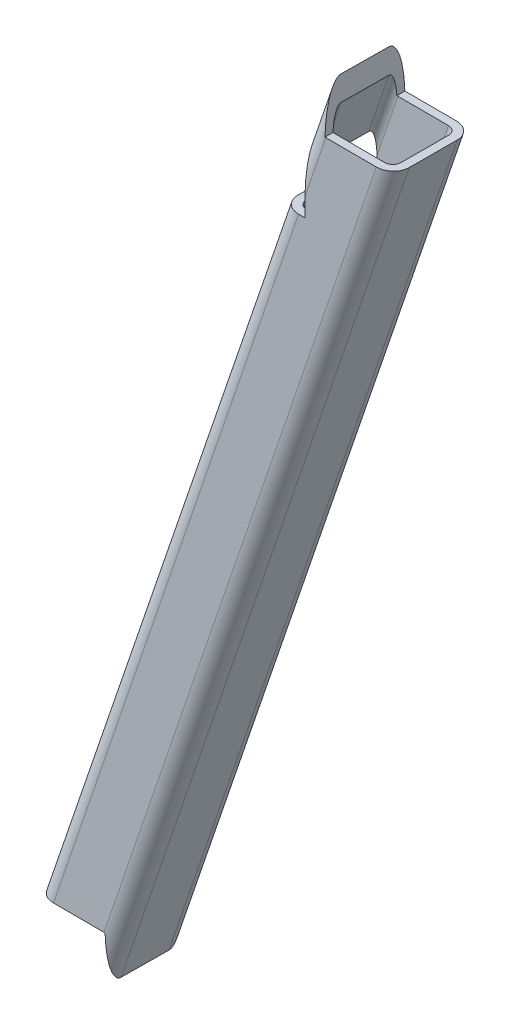
ISO-10303-21;
HEADER;
FILE_DESCRIPTION(('STEP AP214'),'2;1');
FILE_NAME('part.step','',(''),(''),'','','');
FILE_SCHEMA(('AUTOMOTIVE_DESIGN { 1 0 10303 214 1 1 1 1 }'));
ENDSEC;
DATA;
#1=APPLICATION_CONTEXT('core data for automotive mechanical design processes');
#2=APPLICATION_PROTOCOL_DEFINITION('international standard','automotive_design',2000,#1);
#3=PRODUCT_CONTEXT('',#1,'mechanical');
#4=PRODUCT('Part','Part','',(#3));
#5=PRODUCT_RELATED_PRODUCT_CATEGORY('part','',(#4));
#6=PRODUCT_DEFINITION_FORMATION('','',#4);
#7=PRODUCT_DEFINITION_CONTEXT('part definition',#1,'design');
#8=PRODUCT_DEFINITION('design','',#6,#7);
#9=PRODUCT_DEFINITION_SHAPE('','',#8);
#10=(LENGTH_UNIT() NAMED_UNIT(*) SI_UNIT(.MILLI.,.METRE.));
#11=(NAMED_UNIT(*) PLANE_ANGLE_UNIT() SI_UNIT($,.RADIAN.));
#12=(NAMED_UNIT(*) SI_UNIT($,.STERADIAN.) SOLID_ANGLE_UNIT());
#13=UNCERTAINTY_MEASURE_WITH_UNIT(LENGTH_MEASURE(1.E-05),#10,'distance_accuracy_value','');
#14=(GEOMETRIC_REPRESENTATION_CONTEXT(3) GLOBAL_UNCERTAINTY_ASSIGNED_CONTEXT((#13)) GLOBAL_UNIT_ASSIGNED_CONTEXT((#10,
#11,#12)) REPRESENTATION_CONTEXT('',''));
#15=CARTESIAN_POINT('',(0.,0.,0.));
#16=DIRECTION('',(0.,0.,1.));
#17=DIRECTION('',(1.,0.,0.));
#18=AXIS2_PLACEMENT_3D('',#15,#16,#17);
#19=CARTESIAN_POINT('',(244.349922816068,221.92616267634,-2310.01830949611));
#20=DIRECTION('',(-0.00289573675776996,0.000987182985603395,0.999995320078241));
#21=DIRECTION('',(0.99999580734144,0.,0.00289573816876252));
#22=AXIS2_PLACEMENT_3D('',#19,#20,#21);
#23=PLANE('',#22);
#24=DIRECTION('',(-0.99999580734144,0.,-0.00289573816876252));
#25=VECTOR('',#24,1.);
#26=CARTESIAN_POINT('',(244.349831551146,190.,-2309.98679264831));
#27=LINE('',#26,#25);
#28=CARTESIAN_POINT('',(235.,190.,-2310.01386742591));
#29=VERTEX_POINT('',#28);
#30=CARTESIAN_POINT('',(233.466003721887,190.,-2310.01830949611));
#31=VERTEX_POINT('',#30);
#32=EDGE_CURVE('E224',#29,#31,#27,.T.);
#33=ORIENTED_EDGE('',*,*,#32,.F.);
#34=DIRECTION('',(0.,-0.999999512730672,0.000987187124537909));
#35=VECTOR('',#34,1.);
#36=CARTESIAN_POINT('',(235.,221.926135948221,-2310.04538451162));
#37=LINE('',#36,#35);
#38=CARTESIAN_POINT('',(235.,194.499722415875,-2310.01830949611));
#39=VERTEX_POINT('',#38);
#40=EDGE_CURVE('E466',#39,#29,#37,.T.);
#41=ORIENTED_EDGE('',*,*,#40,.F.);
#42=DIRECTION('',(-0.322673927788139,-0.94651018817854,0.));
#43=VECTOR('',#42,1.);
#44=CARTESIAN_POINT('',(244.349922816068,221.92616267634,-2310.01830949611));
#45=LINE('',#44,#43);
#46=CARTESIAN_POINT('',(240.284185539947,210.,-2310.01830949611));
#47=VERTEX_POINT('',#46);
#48=EDGE_CURVE('E243',#47,#39,#45,.T.);
#49=ORIENTED_EDGE('',*,*,#48,.F.);
#50=DIRECTION('',(-0.99999580734144,0.,-0.00289573816876252));
#51=VECTOR('',#50,1.);
#52=CARTESIAN_POINT('',(244.349888723643,210.,-2310.00653623486));
#53=LINE('',#52,#51);
#54=CARTESIAN_POINT('',(252.962278170014,210.,-2309.98159690545));
#55=VERTEX_POINT('',#54);
#56=EDGE_CURVE('E276',#55,#47,#53,.T.);
#57=ORIENTED_EDGE('',*,*,#56,.F.);
#58=DIRECTION('',(-0.322673927788139,-0.94651018817854,0.));
#59=VECTOR('',#58,1.);
#60=CARTESIAN_POINT('',(255.707991919087,218.054093663948,-2309.98159690545));
#61=LINE('',#60,#59);
#62=CARTESIAN_POINT('',(184.780459988186,10.,-2309.98159690545));
#63=VERTEX_POINT('',#62);
#64=EDGE_CURVE('E45',#55,#63,#61,.T.);
#65=ORIENTED_EDGE('',*,*,#64,.T.);
#66=DIRECTION('',(0.99999580734144,0.,0.00289573816876252));
#67=VECTOR('',#66,1.);
#68=CARTESIAN_POINT('',(244.349316998674,10.,-2309.80910036932));
#69=LINE('',#68,#67);
#70=CARTESIAN_POINT('',(172.102367358225,9.99999999999998,-2310.01830949611));
#71=VERTEX_POINT('',#70);
#72=EDGE_CURVE('E242',#71,#63,#69,.T.);
#73=ORIENTED_EDGE('',*,*,#72,.F.);
#74=EDGE_CURVE('E235',#31,#71,#45,.T.);
#75=ORIENTED_EDGE('',*,*,#74,.F.);
#76=EDGE_LOOP('',(#33,#41,#49,#57,#65,#73,#75));
#77=FACE_BOUND('',#76,.T.);
#78=ADVANCED_FACE('F41',(#77),#23,.F.);
#79=CARTESIAN_POINT('',(255.696408972056,218.05804239589,-2305.98161562514));
#80=DIRECTION('',(-0.322673927788139,-0.94651018817854,0.));
#81=DIRECTION('',(0.94651018817854,-0.322673927788139,0.));
#82=AXIS2_PLACEMENT_3D('',#79,#80,#81);
#83=CYLINDRICAL_SURFACE('',#82,3.99999999999994);
#84=CARTESIAN_POINT('',(252.949349064366,210.,-2305.98161562514));
#85=DIRECTION('',(0.,1.,0.));
#86=DIRECTION('',(-1.,0.,0.));
#87=AXIS2_PLACEMENT_3D('',#84,#85,#86);
#88=ELLIPSE('',#87,4.22605065424338,3.99999999999994);
#89=CARTESIAN_POINT('',(257.175379941023,210.,-2305.96937809492));
#90=VERTEX_POINT('',#89);
#91=EDGE_CURVE('E280',#90,#55,#88,.T.);
#92=ORIENTED_EDGE('',*,*,#91,.F.);
#93=DIRECTION('',(-0.322673927788139,-0.94651018817854,0.));
#94=VECTOR('',#93,1.);
#95=CARTESIAN_POINT('',(259.482432006396,216.767352725092,-2305.96937809492));
#96=LINE('',#95,#94);
#97=CARTESIAN_POINT('',(185.,-1.71444782700181,-2305.96937809492));
#98=VERTEX_POINT('',#97);
#99=EDGE_CURVE('E267',#90,#98,#96,.T.);
#100=ORIENTED_EDGE('',*,*,#99,.T.);
#101=CARTESIAN_POINT('',(185.,10.681909411192,-2305.98161562514));
#102=DIRECTION('',(-1.,0.,0.));
#103=DIRECTION('',(0.,-1.,0.));
#104=AXIS2_PLACEMENT_3D('',#101,#102,#103);
#105=ELLIPSE('',#104,12.3964152524472,3.99999999999994);
#106=CARTESIAN_POINT('',(185.,10.,-2309.97555914853));
#107=VERTEX_POINT('',#106);
#108=EDGE_CURVE('E304',#107,#98,#105,.T.);
#109=ORIENTED_EDGE('',*,*,#108,.F.);
#110=CARTESIAN_POINT('',(184.767530882548,10.,-2305.98161562514));
#111=DIRECTION('',(0.,-1.,0.));
#112=DIRECTION('',(-1.,0.,0.));
#113=AXIS2_PLACEMENT_3D('',#110,#111,#112);
#114=ELLIPSE('',#113,4.22605065424338,3.99999999999994);
#115=EDGE_CURVE('E282',#63,#107,#114,.T.);
#116=ORIENTED_EDGE('',*,*,#115,.F.);
#117=ORIENTED_EDGE('',*,*,#64,.F.);
#118=EDGE_LOOP('',(#92,#100,#109,#116,#117));
#119=FACE_BOUND('',#118,.T.);
#120=ADVANCED_FACE('F278',(#119),#83,.T.);
#121=CARTESIAN_POINT('',(259.447683165303,216.77919892092,-2293.96943425398));
#122=DIRECTION('',(-0.946505758584915,0.322672417699403,-0.00305938255490178));
#123=DIRECTION('',(-0.322673927788139,-0.94651018817854,0.));
#124=AXIS2_PLACEMENT_3D('',#121,#122,#123);
#125=PLANE('',#124);
#126=DIRECTION('',(0.00323227465391468,0.,-0.999994776186637));
#127=VECTOR('',#126,1.);
#128=CARTESIAN_POINT('',(257.136616769428,210.,-2293.97690429434));
#129=LINE('',#128,#127);
#130=CARTESIAN_POINT('',(257.13659262408,210.,-2293.96943425398));
#131=VERTEX_POINT('',#130);
#132=EDGE_CURVE('E318',#131,#90,#129,.T.);
#133=ORIENTED_EDGE('',*,*,#132,.F.);
#134=DIRECTION('',(-0.322673927788139,-0.94651018817854,0.));
#135=VECTOR('',#134,1.);
#136=CARTESIAN_POINT('',(259.447683165303,216.77919892092,-2293.96943425398));
#137=LINE('',#136,#135);
#138=CARTESIAN_POINT('',(185.,-1.60067169730181,-2293.96943425398));
#139=VERTEX_POINT('',#138);
#140=EDGE_CURVE('E265',#131,#139,#137,.T.);
#141=ORIENTED_EDGE('',*,*,#140,.T.);
#142=DIRECTION('',(0.,0.00948096236964959,0.999955054666231));
#143=VECTOR('',#142,1.);
#144=CARTESIAN_POINT('',(185.,-1.58104182610061,-2291.89907597549));
#145=LINE('',#144,#143);
#146=EDGE_CURVE('E298',#98,#139,#145,.T.);
#147=ORIENTED_EDGE('',*,*,#146,.F.);
#148=ORIENTED_EDGE('',*,*,#99,.F.);
#149=EDGE_LOOP('',(#133,#141,#147,#148));
#150=FACE_BOUND('',#149,.T.);
#151=ADVANCED_FACE('F317',(#150),#125,.F.);
#152=CARTESIAN_POINT('',(255.661660130963,218.069888591717,-2293.9816717842));
#153=DIRECTION('',(-0.322673927788139,-0.94651018817854,0.));
#154=DIRECTION('',(0.94651018817854,-0.322673927788139,0.));
#155=AXIS2_PLACEMENT_3D('',#152,#153,#154);
#156=CYLINDRICAL_SURFACE('',#155,3.99999999999996);
#157=CARTESIAN_POINT('',(252.910561747423,210.,-2293.9816717842));
#158=DIRECTION('',(0.,1.,0.));
#159=DIRECTION('',(-1.,0.,0.));
#160=AXIS2_PLACEMENT_3D('',#157,#158,#159);
#161=ELLIPSE('',#160,4.2260506542434,3.99999999999996);
#162=CARTESIAN_POINT('',(252.897632641775,210.,-2289.98169050389));
#163=VERTEX_POINT('',#162);
#164=EDGE_CURVE('E319',#163,#131,#161,.T.);
#165=ORIENTED_EDGE('',*,*,#164,.F.);
#166=DIRECTION('',(-0.322673927788139,-0.94651018817854,0.));
#167=VECTOR('',#166,1.);
#168=CARTESIAN_POINT('',(255.650077183932,218.07383732366,-2289.98169050389));
#169=LINE('',#168,#167);
#170=CARTESIAN_POINT('',(184.71581446001,10.,-2289.98169050389));
#171=VERTEX_POINT('',#170);
#172=EDGE_CURVE('E262',#163,#171,#169,.T.);
#173=ORIENTED_EDGE('',*,*,#172,.T.);
#174=CARTESIAN_POINT('',(184.728743565605,10.,-2293.9816717842));
#175=DIRECTION('',(0.,-1.,0.));
#176=DIRECTION('',(-1.,0.,0.));
#177=AXIS2_PLACEMENT_3D('',#174,#175,#176);
#178=ELLIPSE('',#177,4.2260506542434,3.99999999999996);
#179=CARTESIAN_POINT('',(185.,10.,-2289.98992016506));
#180=VERTEX_POINT('',#179);
#181=EDGE_CURVE('E313',#180,#171,#178,.T.);
#182=ORIENTED_EDGE('',*,*,#181,.F.);
#183=CARTESIAN_POINT('',(185.,10.7956855408921,-2293.9816717842));
#184=DIRECTION('',(-1.,0.,0.));
#185=DIRECTION('',(0.,-1.,0.));
#186=AXIS2_PLACEMENT_3D('',#183,#184,#185);
#187=ELLIPSE('',#186,12.3964152524473,3.99999999999996);
#188=EDGE_CURVE('E302',#139,#180,#187,.T.);
#189=ORIENTED_EDGE('',*,*,#188,.F.);
#190=ORIENTED_EDGE('',*,*,#140,.F.);
#191=EDGE_LOOP('',(#165,#173,#182,#189,#190));
#192=FACE_BOUND('',#191,.T.);
#193=ADVANCED_FACE('F312',(#192),#156,.T.);
#194=CARTESIAN_POINT('',(255.650077183932,218.07383732366,-2289.98169050389));
#195=DIRECTION('',(0.00289573675776996,-0.000987182985603395,-0.999995320078241));
#196=DIRECTION('',(-0.99999580734144,0.,-0.00289573816876252));
#197=AXIS2_PLACEMENT_3D('',#194,#195,#196);
#198=PLANE('',#197);
#199=DIRECTION('',(0.99999580734144,0.,0.00289573816876252));
#200=VECTOR('',#199,1.);
#201=CARTESIAN_POINT('',(255.649996931363,190.,-2289.95397659203));
#202=LINE('',#201,#200);
#203=CARTESIAN_POINT('',(233.401358193622,190.,-2290.01840309455));
#204=VERTEX_POINT('',#203);
#205=CARTESIAN_POINT('',(235.,190.,-2290.01377382704));
#206=VERTEX_POINT('',#205);
#207=EDGE_CURVE('E467',#204,#206,#202,.T.);
#208=ORIENTED_EDGE('',*,*,#207,.F.);
#209=DIRECTION('',(-0.322673927788139,-0.94651018817854,0.));
#210=VECTOR('',#209,1.);
#211=CARTESIAN_POINT('',(244.292008080913,221.945906336052,-2290.01840309455));
#212=LINE('',#211,#210);
#213=CARTESIAN_POINT('',(172.037721829986,10.,-2290.01840309455));
#214=VERTEX_POINT('',#213);
#215=EDGE_CURVE('E261',#204,#214,#212,.T.);
#216=ORIENTED_EDGE('',*,*,#215,.T.);
#217=DIRECTION('',(-0.99999580734144,0.,-0.00289573816876252));
#218=VECTOR('',#217,1.);
#219=CARTESIAN_POINT('',(255.649482378891,10.,-2289.77628431305));
#220=LINE('',#219,#218);
#221=EDGE_CURVE('E360',#171,#214,#220,.T.);
#222=ORIENTED_EDGE('',*,*,#221,.F.);
#223=ORIENTED_EDGE('',*,*,#172,.F.);
#224=DIRECTION('',(0.99999580734144,0.,0.00289573816876252));
#225=VECTOR('',#224,1.);
#226=CARTESIAN_POINT('',(255.65005410386,210.,-2289.97372017859));
#227=LINE('',#226,#225);
#228=CARTESIAN_POINT('',(240.219540011771,210.,-2290.01840309455));
#229=VERTEX_POINT('',#228);
#230=EDGE_CURVE('E322',#229,#163,#227,.T.);
#231=ORIENTED_EDGE('',*,*,#230,.F.);
#232=CARTESIAN_POINT('',(235.,194.689349298708,-2290.01840309455));
#233=VERTEX_POINT('',#232);
#234=EDGE_CURVE('E258',#229,#233,#212,.T.);
#235=ORIENTED_EDGE('',*,*,#234,.T.);
#236=DIRECTION('',(0.,0.999999512730672,-0.000987187124537909));
#237=VECTOR('',#236,1.);
#238=CARTESIAN_POINT('',(235.,218.073778292398,-2290.04148791301));
#239=LINE('',#238,#237);
#240=EDGE_CURVE('E481',#206,#233,#239,.T.);
#241=ORIENTED_EDGE('',*,*,#240,.F.);
#242=EDGE_LOOP('',(#208,#216,#222,#223,#231,#235,#241));
#243=FACE_BOUND('',#242,.T.);
#244=ADVANCED_FACE('F424',(#243),#198,.F.);
#245=CARTESIAN_POINT('',(244.303591027944,221.94195760411,-2294.01838437486));
#246=DIRECTION('',(-0.322673927788139,-0.94651018817854,0.));
#247=DIRECTION('',(0.94651018817854,-0.322673927788139,0.));
#248=AXIS2_PLACEMENT_3D('',#245,#246,#247);
#249=CYLINDRICAL_SURFACE('',#248,3.99999999999994);
#250=CARTESIAN_POINT('',(233.41428729927,190.,-2294.01838437486));
#251=DIRECTION('',(0.,1.,0.));
#252=DIRECTION('',(-1.,0.,0.));
#253=AXIS2_PLACEMENT_3D('',#250,#251,#252);
#254=ELLIPSE('',#253,4.22605065424338,3.99999999999994);
#255=CARTESIAN_POINT('',(229.188256422613,190.,-2294.03062190508));
#256=VERTEX_POINT('',#255);
#257=EDGE_CURVE('E436',#256,#204,#254,.T.);
#258=ORIENTED_EDGE('',*,*,#257,.F.);
#259=DIRECTION('',(-0.322673927788139,-0.94651018817854,0.));
#260=VECTOR('',#259,1.);
#261=CARTESIAN_POINT('',(240.517567993604,223.232647274908,-2294.03062190508));
#262=LINE('',#261,#260);
#263=CARTESIAN_POINT('',(167.824620058977,10.,-2294.03062190508));
#264=VERTEX_POINT('',#263);
#265=EDGE_CURVE('E257',#256,#264,#262,.T.);
#266=ORIENTED_EDGE('',*,*,#265,.T.);
#267=CARTESIAN_POINT('',(172.050650935634,10.,-2294.01838437486));
#268=DIRECTION('',(0.,-1.,0.));
#269=DIRECTION('',(-1.,0.,0.));
#270=AXIS2_PLACEMENT_3D('',#267,#268,#269);
#271=ELLIPSE('',#270,4.22605065424338,3.99999999999994);
#272=EDGE_CURVE('E362',#214,#264,#271,.T.);
#273=ORIENTED_EDGE('',*,*,#272,.F.);
#274=ORIENTED_EDGE('',*,*,#215,.F.);
#275=EDGE_LOOP('',(#258,#266,#273,#274));
#276=FACE_BOUND('',#275,.T.);
#277=ADVANCED_FACE('F434',(#276),#249,.T.);
#278=CARTESIAN_POINT('',(235.,194.651423922141,-2294.01838437486));
#279=DIRECTION('',(-1.,0.,0.));
#280=DIRECTION('',(0.,-1.,0.));
#281=AXIS2_PLACEMENT_3D('',#278,#279,#280);
#282=ELLIPSE('',#281,12.3964152524472,3.99999999999994);
#283=CARTESIAN_POINT('',(235.,207.047781160335,-2294.03062190508));
#284=VERTEX_POINT('',#283);
#285=EDGE_CURVE('E483',#233,#284,#282,.T.);
#286=ORIENTED_EDGE('',*,*,#285,.F.);
#287=ORIENTED_EDGE('',*,*,#234,.F.);
#288=CARTESIAN_POINT('',(240.232469117452,210.,-2294.01838437486));
#289=DIRECTION('',(0.,1.,0.));
#290=DIRECTION('',(-1.,0.,0.));
#291=AXIS2_PLACEMENT_3D('',#288,#289,#290);
#292=ELLIPSE('',#291,4.22605065424338,3.99999999999994);
#293=CARTESIAN_POINT('',(240.,210.,-2290.02444085147));
#294=VERTEX_POINT('',#293);
#295=EDGE_CURVE('E376',#294,#229,#292,.T.);
#296=ORIENTED_EDGE('',*,*,#295,.F.);
#297=CARTESIAN_POINT('',(240.,209.318090588808,-2294.01838437486));
#298=DIRECTION('',(1.,0.,0.));
#299=DIRECTION('',(0.,-1.,0.));
#300=AXIS2_PLACEMENT_3D('',#297,#298,#299);
#301=ELLIPSE('',#300,12.3964152524472,3.99999999999994);
#302=CARTESIAN_POINT('',(240.,221.714447827001,-2294.03062190508));
#303=VERTEX_POINT('',#302);
#304=EDGE_CURVE('E525',#303,#294,#301,.T.);
#305=ORIENTED_EDGE('',*,*,#304,.F.);
#306=EDGE_CURVE('E254',#303,#284,#262,.T.);
#307=ORIENTED_EDGE('',*,*,#306,.T.);
#308=EDGE_LOOP('',(#286,#287,#296,#305,#307));
#309=FACE_BOUND('',#308,.T.);
#310=ADVANCED_FACE('F557',(#309),#249,.T.);
#311=CARTESIAN_POINT('',(240.552316834697,223.22080107908,-2306.03056574602));
#312=DIRECTION('',(0.946505758584915,-0.322672417699403,0.00305938255490178));
#313=DIRECTION('',(0.322673927788139,0.94651018817854,0.));
#314=AXIS2_PLACEMENT_3D('',#311,#312,#313);
#315=PLANE('',#314);
#316=DIRECTION('',(-0.00323227465391468,0.,0.999994776186637));
#317=VECTOR('',#316,1.);
#318=CARTESIAN_POINT('',(229.227162061473,190.,-2306.06717194797));
#319=LINE('',#318,#317);
#320=CARTESIAN_POINT('',(229.227043739556,190.,-2306.03056574602));
#321=VERTEX_POINT('',#320);
#322=EDGE_CURVE('E238',#321,#256,#319,.T.);
#323=ORIENTED_EDGE('',*,*,#322,.F.);
#324=DIRECTION('',(-0.322673927788139,-0.94651018817854,0.));
#325=VECTOR('',#324,1.);
#326=CARTESIAN_POINT('',(240.552316834697,223.22080107908,-2306.03056574602));
#327=LINE('',#326,#325);
#328=CARTESIAN_POINT('',(167.86340737592,10.,-2306.03056574602));
#329=VERTEX_POINT('',#328);
#330=EDGE_CURVE('E237',#321,#329,#327,.T.);
#331=ORIENTED_EDGE('',*,*,#330,.T.);
#332=DIRECTION('',(0.00323227465391468,0.,-0.999994776186637));
#333=VECTOR('',#332,1.);
#334=CARTESIAN_POINT('',(167.86416680053,10.,-2306.26551503835));
#335=LINE('',#334,#333);
#336=EDGE_CURVE('E364',#264,#329,#335,.T.);
#337=ORIENTED_EDGE('',*,*,#336,.F.);
#338=ORIENTED_EDGE('',*,*,#265,.F.);
#339=EDGE_LOOP('',(#323,#331,#337,#338));
#340=FACE_BOUND('',#339,.T.);
#341=ADVANCED_FACE('F438',(#340),#315,.F.);
#342=DIRECTION('',(0.,-0.00948096236964905,-0.999955054666231));
#343=VECTOR('',#342,1.);
#344=CARTESIAN_POINT('',(235.,206.935469028704,-2305.87615818577));
#345=LINE('',#344,#343);
#346=CARTESIAN_POINT('',(235.,206.934005030635,-2306.03056574602));
#347=VERTEX_POINT('',#346);
#348=EDGE_CURVE('E485',#284,#347,#345,.T.);
#349=ORIENTED_EDGE('',*,*,#348,.F.);
#350=ORIENTED_EDGE('',*,*,#306,.F.);
#351=DIRECTION('',(0.,0.00948096236964905,0.999955054666231));
#352=VECTOR('',#351,1.);
#353=CARTESIAN_POINT('',(240.,221.60081732854,-2306.01520605069));
#354=LINE('',#353,#352);
#355=CARTESIAN_POINT('',(240.,221.600671697302,-2306.03056574602));
#356=VERTEX_POINT('',#355);
#357=EDGE_CURVE('E523',#356,#303,#354,.T.);
#358=ORIENTED_EDGE('',*,*,#357,.F.);
#359=EDGE_CURVE('E244',#356,#347,#327,.T.);
#360=ORIENTED_EDGE('',*,*,#359,.T.);
#361=EDGE_LOOP('',(#349,#350,#358,#360));
#362=FACE_BOUND('',#361,.T.);
#363=ADVANCED_FACE('F552',(#362),#315,.F.);
#364=CARTESIAN_POINT('',(244.338339869037,221.930111408283,-2306.0183282158));
#365=DIRECTION('',(-0.322673927788139,-0.94651018817854,0.));
#366=DIRECTION('',(0.94651018817854,-0.322673927788139,0.));
#367=AXIS2_PLACEMENT_3D('',#364,#365,#366);
#368=CYLINDRICAL_SURFACE('',#367,3.99999999999996);
#369=CARTESIAN_POINT('',(233.453074616213,190.,-2306.0183282158));
#370=DIRECTION('',(0.,1.,0.));
#371=DIRECTION('',(-1.,0.,0.));
#372=AXIS2_PLACEMENT_3D('',#369,#370,#371);
#373=ELLIPSE('',#372,4.2260506542434,3.99999999999996);
#374=EDGE_CURVE('E220',#31,#321,#373,.T.);
#375=ORIENTED_EDGE('',*,*,#374,.F.);
#376=ORIENTED_EDGE('',*,*,#74,.T.);
#377=CARTESIAN_POINT('',(172.089438252577,10.,-2306.0183282158));
#378=DIRECTION('',(0.,-1.,0.));
#379=DIRECTION('',(-1.,0.,0.));
#380=AXIS2_PLACEMENT_3D('',#377,#378,#379);
#381=ELLIPSE('',#380,4.2260506542434,3.99999999999996);
#382=EDGE_CURVE('E366',#329,#71,#381,.T.);
#383=ORIENTED_EDGE('',*,*,#382,.F.);
#384=ORIENTED_EDGE('',*,*,#330,.F.);
#385=EDGE_LOOP('',(#375,#376,#383,#384));
#386=FACE_BOUND('',#385,.T.);
#387=ADVANCED_FACE('F43',(#386),#368,.T.);
#388=CARTESIAN_POINT('',(235.,194.537647792441,-2306.0183282158));
#389=DIRECTION('',(-1.,0.,0.));
#390=DIRECTION('',(0.,-1.,0.));
#391=AXIS2_PLACEMENT_3D('',#388,#389,#390);
#392=ELLIPSE('',#391,12.3964152524473,3.99999999999996);
#393=EDGE_CURVE('E487',#347,#39,#392,.T.);
#394=ORIENTED_EDGE('',*,*,#393,.F.);
#395=ORIENTED_EDGE('',*,*,#359,.F.);
#396=CARTESIAN_POINT('',(240.,209.204314459108,-2306.0183282158));
#397=DIRECTION('',(1.,0.,0.));
#398=DIRECTION('',(0.,-1.,0.));
#399=AXIS2_PLACEMENT_3D('',#396,#397,#398);
#400=ELLIPSE('',#399,12.3964152524473,3.99999999999996);
#401=CARTESIAN_POINT('',(240.,210.,-2310.01007983494));
#402=VERTEX_POINT('',#401);
#403=EDGE_CURVE('E306',#402,#356,#400,.T.);
#404=ORIENTED_EDGE('',*,*,#403,.F.);
#405=CARTESIAN_POINT('',(240.271256434395,210.,-2306.0183282158));
#406=DIRECTION('',(0.,1.,0.));
#407=DIRECTION('',(-1.,0.,0.));
#408=AXIS2_PLACEMENT_3D('',#405,#406,#407);
#409=ELLIPSE('',#408,4.2260506542434,3.99999999999996);
#410=EDGE_CURVE('E371',#47,#402,#409,.T.);
#411=ORIENTED_EDGE('',*,*,#410,.F.);
#412=ORIENTED_EDGE('',*,*,#48,.T.);
#413=EDGE_LOOP('',(#394,#395,#404,#411,#412));
#414=FACE_BOUND('',#413,.T.);
#415=ADVANCED_FACE('F549',(#414),#368,.T.);
#416=CARTESIAN_POINT('',(-143.999999999999,10.,-200.));
#417=DIRECTION('',(0.,-1.,0.));
#418=DIRECTION('',(0.,0.,-1.));
#419=AXIS2_PLACEMENT_3D('',#416,#417,#418);
#420=PLANE('',#419);
#421=DIRECTION('',(0.99999580734144,0.,0.00289573816872749));
#422=VECTOR('',#421,1.);
#423=CARTESIAN_POINT('',(244.343525519515,10.,-2307.80910778011));
#424=LINE('',#423,#422);
#425=CARTESIAN_POINT('',(172.095902805401,10.,-2308.01831885595));
#426=VERTEX_POINT('',#425);
#427=CARTESIAN_POINT('',(184.773995435377,10.,-2307.9816062653));
#428=VERTEX_POINT('',#427);
#429=EDGE_CURVE('E330',#426,#428,#424,.T.);
#430=ORIENTED_EDGE('',*,*,#429,.F.);
#431=CARTESIAN_POINT('',(172.089438252577,10.,-2306.0183282158));
#432=DIRECTION('',(0.,-1.,0.));
#433=DIRECTION('',(-1.,0.,0.));
#434=AXIS2_PLACEMENT_3D('',#431,#432,#433);
#435=ELLIPSE('',#434,2.11302532712158,1.99999999999987);
#436=CARTESIAN_POINT('',(169.976422814248,10.,-2306.02444698091));
#437=VERTEX_POINT('',#436);
#438=EDGE_CURVE('E335',#437,#426,#435,.T.);
#439=ORIENTED_EDGE('',*,*,#438,.F.);
#440=DIRECTION('',(0.00323227465391468,0.,-0.999994776186637));
#441=VECTOR('',#440,1.);
#442=CARTESIAN_POINT('',(169.977179940345,10.,-2306.25868516385));
#443=LINE('',#442,#441);
#444=CARTESIAN_POINT('',(169.937635497305,10.,-2294.02450313997));
#445=VERTEX_POINT('',#444);
#446=EDGE_CURVE('E340',#445,#437,#443,.T.);
#447=ORIENTED_EDGE('',*,*,#446,.F.);
#448=CARTESIAN_POINT('',(172.050650935634,10.,-2294.01838437486));
#449=DIRECTION('',(0.,-1.,0.));
#450=DIRECTION('',(-1.,0.,0.));
#451=AXIS2_PLACEMENT_3D('',#448,#449,#450);
#452=ELLIPSE('',#451,2.1130253271218,2.00000000000008);
#453=CARTESIAN_POINT('',(172.04418638281,10.,-2292.0183937347));
#454=VERTEX_POINT('',#453);
#455=EDGE_CURVE('E345',#454,#445,#452,.T.);
#456=ORIENTED_EDGE('',*,*,#455,.F.);
#457=DIRECTION('',(-0.99999580734144,0.,-0.00289573816872749));
#458=VECTOR('',#457,1.);
#459=CARTESIAN_POINT('',(255.655273858051,10.,-2291.77627690226));
#460=LINE('',#459,#458);
#461=CARTESIAN_POINT('',(184.722279012774,10.,-2291.98168114404));
#462=VERTEX_POINT('',#461);
#463=EDGE_CURVE('E355',#462,#454,#460,.T.);
#464=ORIENTED_EDGE('',*,*,#463,.F.);
#465=CARTESIAN_POINT('',(184.728743565605,10.,-2293.9816717842));
#466=DIRECTION('',(0.,-1.,0.));
#467=DIRECTION('',(-1.,0.,0.));
#468=AXIS2_PLACEMENT_3D('',#465,#466,#467);
#469=ELLIPSE('',#468,2.11302532712158,1.99999999999987);
#470=CARTESIAN_POINT('',(185.,10.,-2291.99821999782));
#471=VERTEX_POINT('',#470);
#472=EDGE_CURVE('E350',#471,#462,#469,.T.);
#473=ORIENTED_EDGE('',*,*,#472,.F.);
#474=DIRECTION('',(0.,0.,1.));
#475=VECTOR('',#474,1.);
#476=CARTESIAN_POINT('',(185.,10.,-2300.));
#477=LINE('',#476,#475);
#478=EDGE_CURVE('E247',#471,#180,#477,.T.);
#479=ORIENTED_EDGE('',*,*,#478,.T.);
#480=ORIENTED_EDGE('',*,*,#181,.T.);
#481=ORIENTED_EDGE('',*,*,#221,.T.);
#482=ORIENTED_EDGE('',*,*,#272,.T.);
#483=ORIENTED_EDGE('',*,*,#336,.T.);
#484=ORIENTED_EDGE('',*,*,#382,.T.);
#485=ORIENTED_EDGE('',*,*,#72,.T.);
#486=ORIENTED_EDGE('',*,*,#115,.T.);
#487=CARTESIAN_POINT('',(185.,10.,-2307.96947499342));
#488=VERTEX_POINT('',#487);
#489=EDGE_CURVE('E314',#107,#488,#477,.T.);
#490=ORIENTED_EDGE('',*,*,#489,.T.);
#491=CARTESIAN_POINT('',(184.767530882548,10.,-2305.98161562514));
#492=DIRECTION('',(0.,-1.,0.));
#493=DIRECTION('',(-1.,0.,0.));
#494=AXIS2_PLACEMENT_3D('',#491,#492,#493);
#495=ELLIPSE('',#494,2.1130253271218,2.00000000000008);
#496=EDGE_CURVE('E326',#428,#488,#495,.T.);
#497=ORIENTED_EDGE('',*,*,#496,.F.);
#498=EDGE_LOOP('',(#430,#439,#447,#456,#464,#473,#479,#480,#481,#482,#483,#484,#485,#486,#490,#497));
#499=FACE_BOUND('',#498,.T.);
#500=ADVANCED_FACE('F429',(#499),#420,.T.);
#501=CARTESIAN_POINT('',(185.,-6.00000000000001,-2300.));
#502=DIRECTION('',(-1.,0.,0.));
#503=DIRECTION('',(0.,0.,1.));
#504=AXIS2_PLACEMENT_3D('',#501,#502,#503);
#505=PLANE('',#504);
#506=ORIENTED_EDGE('',*,*,#188,.T.);
#507=ORIENTED_EDGE('',*,*,#478,.F.);
#508=CARTESIAN_POINT('',(185.,10.7956855408921,-2293.9816717842));
#509=DIRECTION('',(-1.,0.,0.));
#510=DIRECTION('',(0.,-1.,0.));
#511=AXIS2_PLACEMENT_3D('',#508,#509,#510);
#512=ELLIPSE('',#511,6.1982076262233,1.99999999999987);
#513=CARTESIAN_POINT('',(185.,4.59750692179506,-2293.97555301909));
#514=VERTEX_POINT('',#513);
#515=EDGE_CURVE('E354',#514,#471,#512,.T.);
#516=ORIENTED_EDGE('',*,*,#515,.F.);
#517=DIRECTION('',(0.,0.00948096236964959,0.999955054666231));
#518=VECTOR('',#517,1.);
#519=CARTESIAN_POINT('',(185.,4.61663765627796,-2291.95783858254));
#520=LINE('',#519,#518);
#521=CARTESIAN_POINT('',(185.,4.48373079209513,-2305.97549686003));
#522=VERTEX_POINT('',#521);
#523=EDGE_CURVE('E197',#522,#514,#520,.T.);
#524=ORIENTED_EDGE('',*,*,#523,.F.);
#525=CARTESIAN_POINT('',(185.,10.681909411192,-2305.98161562514));
#526=DIRECTION('',(-1.,0.,0.));
#527=DIRECTION('',(0.,-1.,0.));
#528=AXIS2_PLACEMENT_3D('',#525,#526,#527);
#529=ELLIPSE('',#528,6.19820762622395,2.00000000000008);
#530=EDGE_CURVE('E189',#488,#522,#529,.T.);
#531=ORIENTED_EDGE('',*,*,#530,.F.);
#532=ORIENTED_EDGE('',*,*,#489,.F.);
#533=ORIENTED_EDGE('',*,*,#108,.T.);
#534=ORIENTED_EDGE('',*,*,#146,.T.);
#535=EDGE_LOOP('',(#506,#507,#516,#524,#531,#532,#533,#534));
#536=FACE_BOUND('',#535,.T.);
#537=ADVANCED_FACE('F300',(#536),#505,.T.);
#538=CARTESIAN_POINT('',(240.,214.,-2000.));
#539=DIRECTION('',(1.,0.,0.));
#540=DIRECTION('',(0.,0.,-1.));
#541=AXIS2_PLACEMENT_3D('',#538,#539,#540);
#542=PLANE('',#541);
#543=ORIENTED_EDGE('',*,*,#403,.T.);
#544=ORIENTED_EDGE('',*,*,#357,.T.);
#545=ORIENTED_EDGE('',*,*,#304,.T.);
#546=DIRECTION('',(0.,0.,-1.));
#547=VECTOR('',#546,1.);
#548=CARTESIAN_POINT('',(240.,210.,-2000.));
#549=LINE('',#548,#547);
#550=CARTESIAN_POINT('',(240.,210.,-2292.03052500658));
#551=VERTEX_POINT('',#550);
#552=EDGE_CURVE('E377',#294,#551,#549,.T.);
#553=ORIENTED_EDGE('',*,*,#552,.T.);
#554=CARTESIAN_POINT('',(240.,209.318090588808,-2294.01838437486));
#555=DIRECTION('',(1.,0.,0.));
#556=DIRECTION('',(0.,-1.,0.));
#557=AXIS2_PLACEMENT_3D('',#554,#555,#556);
#558=ELLIPSE('',#557,6.19820762622395,2.00000000000008);
#559=CARTESIAN_POINT('',(240.,215.516269207904,-2294.02450313997));
#560=VERTEX_POINT('',#559);
#561=EDGE_CURVE('E51',#560,#551,#558,.T.);
#562=ORIENTED_EDGE('',*,*,#561,.F.);
#563=DIRECTION('',(0.,0.00948096236964905,0.999955054666231));
#564=VECTOR('',#563,1.);
#565=CARTESIAN_POINT('',(240.,215.403137846162,-2305.95644344364));
#566=LINE('',#565,#564);
#567=CARTESIAN_POINT('',(240.,215.402493078204,-2306.02444698091));
#568=VERTEX_POINT('',#567);
#569=EDGE_CURVE('E456',#568,#560,#566,.T.);
#570=ORIENTED_EDGE('',*,*,#569,.F.);
#571=CARTESIAN_POINT('',(240.,209.204314459108,-2306.0183282158));
#572=DIRECTION('',(1.,0.,0.));
#573=DIRECTION('',(0.,-1.,0.));
#574=AXIS2_PLACEMENT_3D('',#571,#572,#573);
#575=ELLIPSE('',#574,6.1982076262233,1.99999999999987);
#576=CARTESIAN_POINT('',(240.,210.,-2308.00178000218));
#577=VERTEX_POINT('',#576);
#578=EDGE_CURVE('E492',#577,#568,#575,.T.);
#579=ORIENTED_EDGE('',*,*,#578,.F.);
#580=EDGE_CURVE('E373',#577,#402,#549,.T.);
#581=ORIENTED_EDGE('',*,*,#580,.T.);
#582=EDGE_LOOP('',(#543,#544,#545,#553,#562,#570,#579,#581));
#583=FACE_BOUND('',#582,.T.);
#584=ADVANCED_FACE('F534',(#583),#542,.T.);
#585=CARTESIAN_POINT('',(244.,210.,-2000.));
#586=DIRECTION('',(0.,1.,0.));
#587=DIRECTION('',(0.,0.,1.));
#588=AXIS2_PLACEMENT_3D('',#585,#586,#587);
#589=PLANE('',#588);
#590=ORIENTED_EDGE('',*,*,#552,.F.);
#591=ORIENTED_EDGE('',*,*,#295,.T.);
#592=ORIENTED_EDGE('',*,*,#230,.T.);
#593=ORIENTED_EDGE('',*,*,#164,.T.);
#594=ORIENTED_EDGE('',*,*,#132,.T.);
#595=ORIENTED_EDGE('',*,*,#91,.T.);
#596=ORIENTED_EDGE('',*,*,#56,.T.);
#597=ORIENTED_EDGE('',*,*,#410,.T.);
#598=ORIENTED_EDGE('',*,*,#580,.F.);
#599=CARTESIAN_POINT('',(240.271256434395,210.,-2306.0183282158));
#600=DIRECTION('',(0.,1.,0.));
#601=DIRECTION('',(-1.,0.,0.));
#602=AXIS2_PLACEMENT_3D('',#599,#600,#601);
#603=ELLIPSE('',#602,2.11302532712158,1.99999999999987);
#604=CARTESIAN_POINT('',(240.277720987196,210.,-2308.01831885595));
#605=VERTEX_POINT('',#604);
#606=EDGE_CURVE('E474',#605,#577,#603,.T.);
#607=ORIENTED_EDGE('',*,*,#606,.F.);
#608=DIRECTION('',(-0.99999580734144,0.,-0.00289573816872749));
#609=VECTOR('',#608,1.);
#610=CARTESIAN_POINT('',(244.344097244484,210.,-2308.00654364565));
#611=LINE('',#610,#609);
#612=CARTESIAN_POINT('',(252.95581361719,210.,-2307.9816062653));
#613=VERTEX_POINT('',#612);
#614=EDGE_CURVE('E333',#613,#605,#611,.T.);
#615=ORIENTED_EDGE('',*,*,#614,.F.);
#616=CARTESIAN_POINT('',(252.949349064366,210.,-2305.98161562514));
#617=DIRECTION('',(0.,1.,0.));
#618=DIRECTION('',(-1.,0.,0.));
#619=AXIS2_PLACEMENT_3D('',#616,#617,#618);
#620=ELLIPSE('',#619,2.1130253271218,2.00000000000008);
#621=CARTESIAN_POINT('',(255.062364502695,210.,-2305.97549686003));
#622=VERTEX_POINT('',#621);
#623=EDGE_CURVE('E394',#622,#613,#620,.T.);
#624=ORIENTED_EDGE('',*,*,#623,.F.);
#625=DIRECTION('',(0.00323227465391468,0.,-0.999994776186637));
#626=VECTOR('',#625,1.);
#627=CARTESIAN_POINT('',(255.023603629613,210.,-2293.98373416883));
#628=LINE('',#627,#626);
#629=CARTESIAN_POINT('',(255.023577185752,210.,-2293.97555301909));
#630=VERTEX_POINT('',#629);
#631=EDGE_CURVE('E353',#630,#622,#628,.T.);
#632=ORIENTED_EDGE('',*,*,#631,.F.);
#633=CARTESIAN_POINT('',(252.910561747423,210.,-2293.9816717842));
#634=DIRECTION('',(0.,1.,0.));
#635=DIRECTION('',(-1.,0.,0.));
#636=AXIS2_PLACEMENT_3D('',#633,#634,#635);
#637=ELLIPSE('',#636,2.11302532712158,1.99999999999987);
#638=CARTESIAN_POINT('',(252.904097194599,210.,-2291.98168114404));
#639=VERTEX_POINT('',#638);
#640=EDGE_CURVE('E358',#639,#630,#637,.T.);
#641=ORIENTED_EDGE('',*,*,#640,.F.);
#642=DIRECTION('',(0.99999580734144,0.,0.00289573816872749));
#643=VECTOR('',#642,1.);
#644=CARTESIAN_POINT('',(255.65584558302,210.,-2291.9737127678));
#645=LINE('',#644,#643);
#646=CARTESIAN_POINT('',(240.226004564593,210.,-2292.0183937347));
#647=VERTEX_POINT('',#646);
#648=EDGE_CURVE('E410',#647,#639,#645,.T.);
#649=ORIENTED_EDGE('',*,*,#648,.F.);
#650=CARTESIAN_POINT('',(240.232469117452,210.,-2294.01838437486));
#651=DIRECTION('',(0.,1.,0.));
#652=DIRECTION('',(-1.,0.,0.));
#653=AXIS2_PLACEMENT_3D('',#650,#651,#652);
#654=ELLIPSE('',#653,2.1130253271218,2.00000000000008);
#655=EDGE_CURVE('E11',#551,#647,#654,.T.);
#656=ORIENTED_EDGE('',*,*,#655,.F.);
#657=EDGE_LOOP('',(#590,#591,#592,#593,#594,#595,#596,#597,#598,#607,#615,#624,#632,#641,#649,#656));
#658=FACE_BOUND('',#657,.T.);
#659=ADVANCED_FACE('F417',(#658),#589,.T.);
#660=CARTESIAN_POINT('',(219.,190.,-200.));
#661=DIRECTION('',(0.,1.,0.));
#662=DIRECTION('',(0.,0.,1.));
#663=AXIS2_PLACEMENT_3D('',#660,#661,#662);
#664=PLANE('',#663);
#665=DIRECTION('',(0.,0.,-1.));
#666=VECTOR('',#665,1.);
#667=CARTESIAN_POINT('',(235.,190.,-200.));
#668=LINE('',#667,#666);
#669=CARTESIAN_POINT('',(235.,190.,-2308.01385806603));
#670=VERTEX_POINT('',#669);
#671=EDGE_CURVE('E226',#670,#29,#668,.T.);
#672=ORIENTED_EDGE('',*,*,#671,.T.);
#673=ORIENTED_EDGE('',*,*,#32,.T.);
#674=ORIENTED_EDGE('',*,*,#374,.T.);
#675=ORIENTED_EDGE('',*,*,#322,.T.);
#676=ORIENTED_EDGE('',*,*,#257,.T.);
#677=ORIENTED_EDGE('',*,*,#207,.T.);
#678=CARTESIAN_POINT('',(235.,190.,-2292.01378318693));
#679=VERTEX_POINT('',#678);
#680=EDGE_CURVE('E372',#206,#679,#668,.T.);
#681=ORIENTED_EDGE('',*,*,#680,.T.);
#682=DIRECTION('',(0.99999580734144,0.,0.00289573816872749));
#683=VECTOR('',#682,1.);
#684=CARTESIAN_POINT('',(255.655788410523,190.,-2291.95396918124));
#685=LINE('',#684,#683);
#686=CARTESIAN_POINT('',(233.407822746451,190.,-2292.0183937347));
#687=VERTEX_POINT('',#686);
#688=EDGE_CURVE('E464',#687,#679,#685,.T.);
#689=ORIENTED_EDGE('',*,*,#688,.F.);
#690=CARTESIAN_POINT('',(233.41428729927,190.,-2294.01838437486));
#691=DIRECTION('',(0.,1.,0.));
#692=DIRECTION('',(-1.,0.,0.));
#693=AXIS2_PLACEMENT_3D('',#690,#691,#692);
#694=ELLIPSE('',#693,2.1130253271218,2.00000000000008);
#695=CARTESIAN_POINT('',(231.301271860942,190.,-2294.02450313997));
#696=VERTEX_POINT('',#695);
#697=EDGE_CURVE('E455',#696,#687,#694,.T.);
#698=ORIENTED_EDGE('',*,*,#697,.F.);
#699=DIRECTION('',(-0.00323227465391468,0.,0.999994776186637));
#700=VECTOR('',#699,1.);
#701=CARTESIAN_POINT('',(231.340175201289,190.,-2306.06034207347));
#702=LINE('',#701,#700);
#703=CARTESIAN_POINT('',(231.340059177885,190.,-2306.02444698091));
#704=VERTEX_POINT('',#703);
#705=EDGE_CURVE('E462',#704,#696,#702,.T.);
#706=ORIENTED_EDGE('',*,*,#705,.F.);
#707=CARTESIAN_POINT('',(233.453074616213,190.,-2306.0183282158));
#708=DIRECTION('',(0.,1.,0.));
#709=DIRECTION('',(-1.,0.,0.));
#710=AXIS2_PLACEMENT_3D('',#707,#708,#709);
#711=ELLIPSE('',#710,2.11302532712158,1.99999999999987);
#712=CARTESIAN_POINT('',(233.459539169037,190.,-2308.01831885595));
#713=VERTEX_POINT('',#712);
#714=EDGE_CURVE('E391',#713,#704,#711,.T.);
#715=ORIENTED_EDGE('',*,*,#714,.F.);
#716=DIRECTION('',(-0.99999580734144,0.,-0.00289573816872749));
#717=VECTOR('',#716,1.);
#718=CARTESIAN_POINT('',(244.344040071987,190.,-2307.9868000591));
#719=LINE('',#718,#717);
#720=EDGE_CURVE('E472',#670,#713,#719,.T.);
#721=ORIENTED_EDGE('',*,*,#720,.F.);
#722=EDGE_LOOP('',(#672,#673,#674,#675,#676,#677,#681,#689,#698,#706,#715,#721));
#723=FACE_BOUND('',#722,.T.);
#724=ADVANCED_FACE('F225',(#723),#664,.T.);
#725=CARTESIAN_POINT('',(235.,206.,-200.));
#726=DIRECTION('',(-1.,0.,0.));
#727=DIRECTION('',(0.,0.,1.));
#728=AXIS2_PLACEMENT_3D('',#725,#726,#727);
#729=PLANE('',#728);
#730=CARTESIAN_POINT('',(235.,194.537647792441,-2306.0183282158));
#731=DIRECTION('',(-1.,0.,0.));
#732=DIRECTION('',(0.,-1.,0.));
#733=AXIS2_PLACEMENT_3D('',#730,#731,#732);
#734=ELLIPSE('',#733,6.1982076262233,1.99999999999987);
#735=CARTESIAN_POINT('',(235.,200.735826411538,-2306.02444698091));
#736=VERTEX_POINT('',#735);
#737=CARTESIAN_POINT('',(235.,194.518685104158,-2308.01831885595));
#738=VERTEX_POINT('',#737);
#739=EDGE_CURVE('E387',#736,#738,#734,.T.);
#740=ORIENTED_EDGE('',*,*,#739,.F.);
#741=DIRECTION('',(0.,-0.00948096236964905,-0.999955054666231));
#742=VECTOR('',#741,1.);
#743=CARTESIAN_POINT('',(235.,200.737789546325,-2305.81739557872));
#744=LINE('',#743,#742);
#745=CARTESIAN_POINT('',(235.,200.849602541238,-2294.02450313997));
#746=VERTEX_POINT('',#745);
#747=EDGE_CURVE('E384',#746,#736,#744,.T.);
#748=ORIENTED_EDGE('',*,*,#747,.F.);
#749=CARTESIAN_POINT('',(235.,194.651423922141,-2294.01838437486));
#750=DIRECTION('',(-1.,0.,0.));
#751=DIRECTION('',(0.,-1.,0.));
#752=AXIS2_PLACEMENT_3D('',#749,#750,#751);
#753=ELLIPSE('',#752,6.19820762622395,2.00000000000008);
#754=CARTESIAN_POINT('',(235.,194.670386610425,-2292.0183937347));
#755=VERTEX_POINT('',#754);
#756=EDGE_CURVE('E381',#755,#746,#753,.T.);
#757=ORIENTED_EDGE('',*,*,#756,.F.);
#758=DIRECTION('',(0.,0.999999512730672,-0.00098718712452597));
#759=VECTOR('',#758,1.);
#760=CARTESIAN_POINT('',(235.,218.071803909871,-2292.04149532381));
#761=LINE('',#760,#759);
#762=EDGE_CURVE('E413',#679,#755,#761,.T.);
#763=ORIENTED_EDGE('',*,*,#762,.F.);
#764=ORIENTED_EDGE('',*,*,#680,.F.);
#765=ORIENTED_EDGE('',*,*,#240,.T.);
#766=ORIENTED_EDGE('',*,*,#285,.T.);
#767=ORIENTED_EDGE('',*,*,#348,.T.);
#768=ORIENTED_EDGE('',*,*,#393,.T.);
#769=ORIENTED_EDGE('',*,*,#40,.T.);
#770=ORIENTED_EDGE('',*,*,#671,.F.);
#771=DIRECTION('',(0.,-0.999999512730672,0.00098718712452597));
#772=VECTOR('',#771,1.);
#773=CARTESIAN_POINT('',(235.,221.928110330748,-2308.04537710081));
#774=LINE('',#773,#772);
#775=EDGE_CURVE('E60',#738,#670,#774,.T.);
#776=ORIENTED_EDGE('',*,*,#775,.F.);
#777=EDGE_LOOP('',(#740,#748,#757,#763,#764,#765,#766,#767,#768,#769,#770,#776));
#778=FACE_BOUND('',#777,.T.);
#779=ADVANCED_FACE('F560',(#778),#729,.T.);
#780=CARTESIAN_POINT('',(255.655868657447,218.071862957688,-2291.98168114404));
#781=DIRECTION('',(0.00289573675773493,-0.000987182985591456,-0.999995320078241));
#782=DIRECTION('',(-0.99999580734144,0.,-0.00289573816872749));
#783=AXIS2_PLACEMENT_3D('',#780,#781,#782);
#784=PLANE('',#783);
#785=DIRECTION('',(-0.322673927788139,-0.94651018817854,0.));
#786=VECTOR('',#785,1.);
#787=CARTESIAN_POINT('',(244.297799554429,221.943931970081,-2292.0183937347));
#788=LINE('',#787,#786);
#789=EDGE_CURVE('E349',#687,#454,#788,.T.);
#790=ORIENTED_EDGE('',*,*,#789,.F.);
#791=ORIENTED_EDGE('',*,*,#688,.T.);
#792=ORIENTED_EDGE('',*,*,#762,.T.);
#793=EDGE_CURVE('E348',#647,#755,#788,.T.);
#794=ORIENTED_EDGE('',*,*,#793,.F.);
#795=ORIENTED_EDGE('',*,*,#648,.T.);
#796=DIRECTION('',(-0.322673927788139,-0.94651018817854,0.));
#797=VECTOR('',#796,1.);
#798=CARTESIAN_POINT('',(255.655868657447,218.071862957688,-2291.98168114404));
#799=LINE('',#798,#797);
#800=EDGE_CURVE('E251',#639,#462,#799,.T.);
#801=ORIENTED_EDGE('',*,*,#800,.T.);
#802=ORIENTED_EDGE('',*,*,#463,.T.);
#803=EDGE_LOOP('',(#790,#791,#792,#794,#795,#801,#802));
#804=FACE_BOUND('',#803,.T.);
#805=ADVANCED_FACE('F451',(#804),#784,.T.);
#806=CARTESIAN_POINT('',(255.661660130963,218.069888591717,-2293.9816717842));
#807=DIRECTION('',(-0.322673927788139,-0.94651018817854,0.));
#808=DIRECTION('',(0.94651018817854,-0.322673927788139,0.));
#809=AXIS2_PLACEMENT_3D('',#806,#807,#808);
#810=CYLINDRICAL_SURFACE('',#809,1.99999999999987);
#811=ORIENTED_EDGE('',*,*,#800,.F.);
#812=ORIENTED_EDGE('',*,*,#640,.T.);
#813=DIRECTION('',(-0.322673927788139,-0.94651018817854,0.));
#814=VECTOR('',#813,1.);
#815=CARTESIAN_POINT('',(257.554671648133,217.424543756318,-2293.97555301909));
#816=LINE('',#815,#814);
#817=EDGE_CURVE('E397',#630,#514,#816,.T.);
#818=ORIENTED_EDGE('',*,*,#817,.T.);
#819=ORIENTED_EDGE('',*,*,#515,.T.);
#820=ORIENTED_EDGE('',*,*,#472,.T.);
#821=EDGE_LOOP('',(#811,#812,#818,#819,#820));
#822=FACE_BOUND('',#821,.T.);
#823=ADVANCED_FACE('F562',(#822),#810,.F.);
#824=CARTESIAN_POINT('',(257.554671648133,217.424543756318,-2293.97555301909));
#825=DIRECTION('',(-0.946505758584915,0.322672417699403,-0.00305938255490178));
#826=DIRECTION('',(-0.322673927788139,-0.94651018817854,0.));
#827=AXIS2_PLACEMENT_3D('',#824,#825,#826);
#828=PLANE('',#827);
#829=ORIENTED_EDGE('',*,*,#817,.F.);
#830=ORIENTED_EDGE('',*,*,#631,.T.);
#831=DIRECTION('',(-0.322673927788139,-0.94651018817854,0.));
#832=VECTOR('',#831,1.);
#833=CARTESIAN_POINT('',(257.589420489226,217.412697560491,-2305.97549686003));
#834=LINE('',#833,#832);
#835=EDGE_CURVE('E395',#622,#522,#834,.T.);
#836=ORIENTED_EDGE('',*,*,#835,.T.);
#837=ORIENTED_EDGE('',*,*,#523,.T.);
#838=EDGE_LOOP('',(#829,#830,#836,#837));
#839=FACE_BOUND('',#838,.T.);
#840=ADVANCED_FACE('F564',(#839),#828,.T.);
#841=CARTESIAN_POINT('',(255.696408972056,218.05804239589,-2305.98161562514));
#842=DIRECTION('',(-0.322673927788139,-0.94651018817854,0.));
#843=DIRECTION('',(0.94651018817854,-0.322673927788139,0.));
#844=AXIS2_PLACEMENT_3D('',#841,#842,#843);
#845=CYLINDRICAL_SURFACE('',#844,2.00000000000008);
#846=ORIENTED_EDGE('',*,*,#835,.F.);
#847=ORIENTED_EDGE('',*,*,#623,.T.);
#848=DIRECTION('',(-0.322673927788139,-0.94651018817854,0.));
#849=VECTOR('',#848,1.);
#850=CARTESIAN_POINT('',(255.702200445571,218.056068029919,-2307.9816062653));
#851=LINE('',#850,#849);
#852=EDGE_CURVE('E329',#613,#428,#851,.T.);
#853=ORIENTED_EDGE('',*,*,#852,.T.);
#854=ORIENTED_EDGE('',*,*,#496,.T.);
#855=ORIENTED_EDGE('',*,*,#530,.T.);
#856=EDGE_LOOP('',(#846,#847,#853,#854,#855));
#857=FACE_BOUND('',#856,.T.);
#858=ADVANCED_FACE('F571',(#857),#845,.F.);
#859=CARTESIAN_POINT('',(244.344131342553,221.928137042312,-2308.01831885595));
#860=DIRECTION('',(-0.00289573675773493,0.000987182985591456,0.999995320078241));
#861=DIRECTION('',(0.99999580734144,0.,0.00289573816872749));
#862=AXIS2_PLACEMENT_3D('',#859,#860,#861);
#863=PLANE('',#862);
#864=ORIENTED_EDGE('',*,*,#775,.T.);
#865=ORIENTED_EDGE('',*,*,#720,.T.);
#866=DIRECTION('',(-0.322673927788139,-0.94651018817854,0.));
#867=VECTOR('',#866,1.);
#868=CARTESIAN_POINT('',(244.344131342553,221.928137042312,-2308.01831885595));
#869=LINE('',#868,#867);
#870=EDGE_CURVE('E334',#713,#426,#869,.T.);
#871=ORIENTED_EDGE('',*,*,#870,.T.);
#872=ORIENTED_EDGE('',*,*,#429,.T.);
#873=ORIENTED_EDGE('',*,*,#852,.F.);
#874=ORIENTED_EDGE('',*,*,#614,.T.);
#875=EDGE_CURVE('E388',#605,#738,#869,.T.);
#876=ORIENTED_EDGE('',*,*,#875,.T.);
#877=EDGE_LOOP('',(#864,#865,#871,#872,#873,#874,#876));
#878=FACE_BOUND('',#877,.T.);
#879=ADVANCED_FACE('F540',(#878),#863,.T.);
#880=CARTESIAN_POINT('',(244.338339869037,221.930111408283,-2306.0183282158));
#881=DIRECTION('',(-0.322673927788139,-0.94651018817854,0.));
#882=DIRECTION('',(0.94651018817854,-0.322673927788139,0.));
#883=AXIS2_PLACEMENT_3D('',#880,#881,#882);
#884=CYLINDRICAL_SURFACE('',#883,1.99999999999987);
#885=ORIENTED_EDGE('',*,*,#870,.F.);
#886=ORIENTED_EDGE('',*,*,#714,.T.);
#887=DIRECTION('',(-0.322673927788139,-0.94651018817854,0.));
#888=VECTOR('',#887,1.);
#889=CARTESIAN_POINT('',(242.445328351867,222.575456243682,-2306.02444698091));
#890=LINE('',#889,#888);
#891=EDGE_CURVE('E339',#704,#437,#890,.T.);
#892=ORIENTED_EDGE('',*,*,#891,.T.);
#893=ORIENTED_EDGE('',*,*,#438,.T.);
#894=EDGE_LOOP('',(#885,#886,#892,#893));
#895=FACE_BOUND('',#894,.T.);
#896=ADVANCED_FACE('F509',(#895),#884,.F.);
#897=EDGE_CURVE('E338',#568,#736,#890,.T.);
#898=ORIENTED_EDGE('',*,*,#897,.T.);
#899=ORIENTED_EDGE('',*,*,#739,.T.);
#900=ORIENTED_EDGE('',*,*,#875,.F.);
#901=ORIENTED_EDGE('',*,*,#606,.T.);
#902=ORIENTED_EDGE('',*,*,#578,.T.);
#903=EDGE_LOOP('',(#898,#899,#900,#901,#902));
#904=FACE_BOUND('',#903,.T.);
#905=ADVANCED_FACE('F537',(#904),#884,.F.);
#906=CARTESIAN_POINT('',(242.445328351867,222.575456243682,-2306.02444698091));
#907=DIRECTION('',(0.946505758584915,-0.322672417699403,0.00305938255490178));
#908=DIRECTION('',(0.322673927788139,0.94651018817854,0.));
#909=AXIS2_PLACEMENT_3D('',#906,#907,#908);
#910=PLANE('',#909);
#911=ORIENTED_EDGE('',*,*,#891,.F.);
#912=ORIENTED_EDGE('',*,*,#705,.T.);
#913=DIRECTION('',(-0.322673927788139,-0.94651018817854,0.));
#914=VECTOR('',#913,1.);
#915=CARTESIAN_POINT('',(242.410579510774,222.587302439509,-2294.02450313997));
#916=LINE('',#915,#914);
#917=EDGE_CURVE('E344',#696,#445,#916,.T.);
#918=ORIENTED_EDGE('',*,*,#917,.T.);
#919=ORIENTED_EDGE('',*,*,#446,.T.);
#920=EDGE_LOOP('',(#911,#912,#918,#919));
#921=FACE_BOUND('',#920,.T.);
#922=ADVANCED_FACE('F513',(#921),#910,.T.);
#923=EDGE_CURVE('E343',#560,#746,#916,.T.);
#924=ORIENTED_EDGE('',*,*,#923,.T.);
#925=ORIENTED_EDGE('',*,*,#747,.T.);
#926=ORIENTED_EDGE('',*,*,#897,.F.);
#927=ORIENTED_EDGE('',*,*,#569,.T.);
#928=EDGE_LOOP('',(#924,#925,#926,#927));
#929=FACE_BOUND('',#928,.T.);
#930=ADVANCED_FACE('F536',(#929),#910,.T.);
#931=CARTESIAN_POINT('',(244.303591027944,221.94195760411,-2294.01838437486));
#932=DIRECTION('',(-0.322673927788139,-0.94651018817854,0.));
#933=DIRECTION('',(0.94651018817854,-0.322673927788139,0.));
#934=AXIS2_PLACEMENT_3D('',#931,#932,#933);
#935=CYLINDRICAL_SURFACE('',#934,2.00000000000008);
#936=ORIENTED_EDGE('',*,*,#917,.F.);
#937=ORIENTED_EDGE('',*,*,#697,.T.);
#938=ORIENTED_EDGE('',*,*,#789,.T.);
#939=ORIENTED_EDGE('',*,*,#455,.T.);
#940=EDGE_LOOP('',(#936,#937,#938,#939));
#941=FACE_BOUND('',#940,.T.);
#942=ADVANCED_FACE('F454',(#941),#935,.F.);
#943=ORIENTED_EDGE('',*,*,#793,.T.);
#944=ORIENTED_EDGE('',*,*,#756,.T.);
#945=ORIENTED_EDGE('',*,*,#923,.F.);
#946=ORIENTED_EDGE('',*,*,#561,.T.);
#947=ORIENTED_EDGE('',*,*,#655,.T.);
#948=EDGE_LOOP('',(#943,#944,#945,#946,#947));
#949=FACE_BOUND('',#948,.T.);
#950=ADVANCED_FACE('F530',(#949),#935,.F.);
#951=CLOSED_SHELL('',(#78,#120,#151,#193,#244,#277,#310,#341,#363,#387,#415,#500,#537,#584,#659,
#724,#779,#805,#823,#840,#858,#879,#896,#905,#922,#930,#942,#950));
#952=MANIFOLD_SOLID_BREP('B2',#951);
#953=ADVANCED_BREP_SHAPE_REPRESENTATION('',(#18,#952),#14);
#954=SHAPE_DEFINITION_REPRESENTATION(#9,#953);
ENDSEC;
END-ISO-10303-21;
